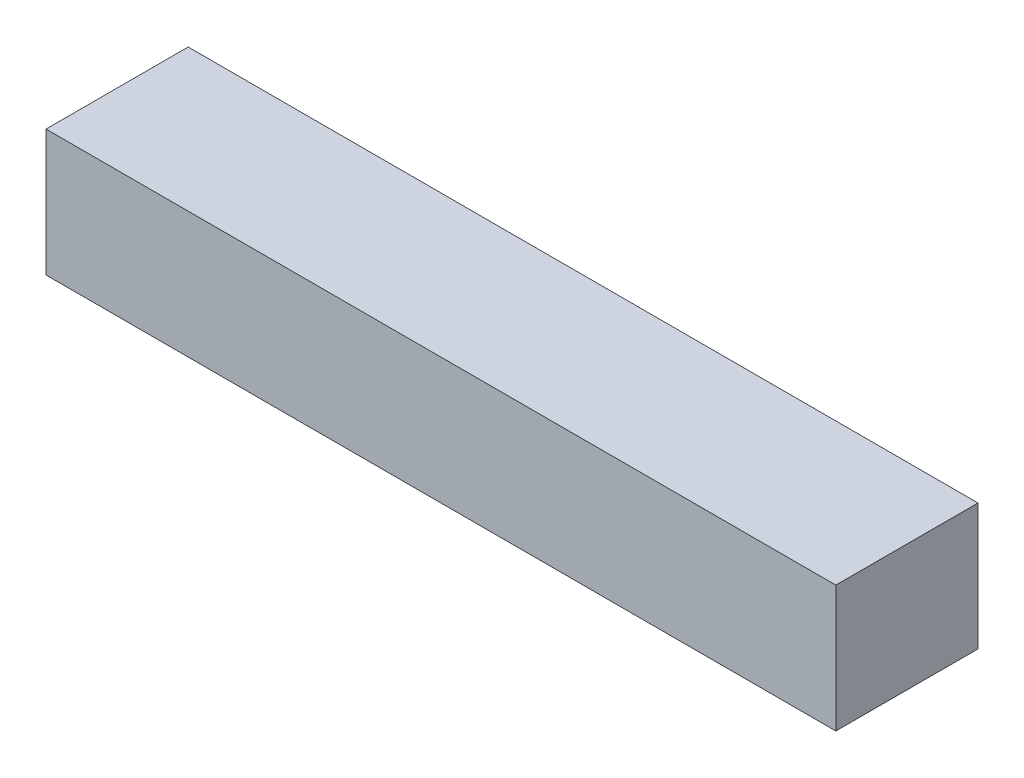
ISO-10303-21;
HEADER;
FILE_DESCRIPTION(('STEP AP214'),'2;1');
FILE_NAME('part.step','',(''),(''),'','','');
FILE_SCHEMA(('AUTOMOTIVE_DESIGN { 1 0 10303 214 1 1 1 1 }'));
ENDSEC;
DATA;
#1=APPLICATION_CONTEXT('core data for automotive mechanical design processes');
#2=APPLICATION_PROTOCOL_DEFINITION('international standard','automotive_design',2000,#1);
#3=PRODUCT_CONTEXT('',#1,'mechanical');
#4=PRODUCT('Part','Part','',(#3));
#5=PRODUCT_RELATED_PRODUCT_CATEGORY('part','',(#4));
#6=PRODUCT_DEFINITION_FORMATION('','',#4);
#7=PRODUCT_DEFINITION_CONTEXT('part definition',#1,'design');
#8=PRODUCT_DEFINITION('design','',#6,#7);
#9=PRODUCT_DEFINITION_SHAPE('','',#8);
#10=(LENGTH_UNIT() NAMED_UNIT(*) SI_UNIT(.MILLI.,.METRE.));
#11=(NAMED_UNIT(*) PLANE_ANGLE_UNIT() SI_UNIT($,.RADIAN.));
#12=(NAMED_UNIT(*) SI_UNIT($,.STERADIAN.) SOLID_ANGLE_UNIT());
#13=UNCERTAINTY_MEASURE_WITH_UNIT(LENGTH_MEASURE(1.E-05),#10,'distance_accuracy_value','');
#14=(GEOMETRIC_REPRESENTATION_CONTEXT(3) GLOBAL_UNCERTAINTY_ASSIGNED_CONTEXT((#13)) GLOBAL_UNIT_ASSIGNED_CONTEXT((#10,
#11,#12)) REPRESENTATION_CONTEXT('',''));
#15=CARTESIAN_POINT('',(0.,0.,0.));
#16=DIRECTION('',(0.,0.,1.));
#17=DIRECTION('',(1.,0.,0.));
#18=AXIS2_PLACEMENT_3D('',#15,#16,#17);
#19=CARTESIAN_POINT('',(79.,176.,39.));
#20=DIRECTION('',(0.,0.,-1.));
#21=DIRECTION('',(-1.,0.,0.));
#22=AXIS2_PLACEMENT_3D('',#19,#20,#21);
#23=PLANE('',#22);
#24=DIRECTION('',(0.,-1.,0.));
#25=VECTOR('',#24,1.);
#26=CARTESIAN_POINT('',(54.,176.,39.));
#27=LINE('',#26,#25);
#28=CARTESIAN_POINT('',(54.,180.,39.));
#29=VERTEX_POINT('',#28);
#30=CARTESIAN_POINT('',(54.,176.,39.));
#31=VERTEX_POINT('',#30);
#32=EDGE_CURVE('E133',#29,#31,#27,.T.);
#33=ORIENTED_EDGE('',*,*,#32,.T.);
#34=DIRECTION('',(-1.,0.,0.));
#35=VECTOR('',#34,1.);
#36=CARTESIAN_POINT('',(79.,176.,39.));
#37=LINE('',#36,#35);
#38=CARTESIAN_POINT('',(79.,176.,39.));
#39=VERTEX_POINT('',#38);
#40=EDGE_CURVE('E167',#39,#31,#37,.T.);
#41=ORIENTED_EDGE('',*,*,#40,.F.);
#42=DIRECTION('',(0.,-1.,0.));
#43=VECTOR('',#42,1.);
#44=CARTESIAN_POINT('',(79.,176.,39.));
#45=LINE('',#44,#43);
#46=CARTESIAN_POINT('',(79.,180.,39.));
#47=VERTEX_POINT('',#46);
#48=EDGE_CURVE('E147',#47,#39,#45,.T.);
#49=ORIENTED_EDGE('',*,*,#48,.F.);
#50=DIRECTION('',(-1.,0.,0.));
#51=VECTOR('',#50,1.);
#52=CARTESIAN_POINT('',(79.,180.,39.));
#53=LINE('',#52,#51);
#54=EDGE_CURVE('E153',#47,#29,#53,.T.);
#55=ORIENTED_EDGE('',*,*,#54,.T.);
#56=EDGE_LOOP('',(#33,#41,#49,#55));
#57=FACE_BOUND('',#56,.T.);
#58=ADVANCED_FACE('F41',(#57),#23,.F.);
#59=CARTESIAN_POINT('',(79.,176.,34.5));
#60=DIRECTION('',(0.,1.,0.));
#61=DIRECTION('',(0.,0.,1.));
#62=AXIS2_PLACEMENT_3D('',#59,#60,#61);
#63=PLANE('',#62);
#64=DIRECTION('',(-1.,0.,0.));
#65=VECTOR('',#64,1.);
#66=CARTESIAN_POINT('',(79.,176.,37.6));
#67=LINE('',#66,#65);
#68=CARTESIAN_POINT('',(69.44,176.,37.6));
#69=VERTEX_POINT('',#68);
#70=CARTESIAN_POINT('',(63.24,176.,37.6));
#71=VERTEX_POINT('',#70);
#72=EDGE_CURVE('E48',#69,#71,#67,.T.);
#73=ORIENTED_EDGE('',*,*,#72,.F.);
#74=DIRECTION('',(0.,0.,-1.));
#75=VECTOR('',#74,1.);
#76=CARTESIAN_POINT('',(69.44,176.,34.5));
#77=LINE('',#76,#75);
#78=CARTESIAN_POINT('',(69.44,176.,35.4));
#79=VERTEX_POINT('',#78);
#80=EDGE_CURVE('E11',#69,#79,#77,.T.);
#81=ORIENTED_EDGE('',*,*,#80,.T.);
#82=DIRECTION('',(1.,0.,0.));
#83=VECTOR('',#82,1.);
#84=CARTESIAN_POINT('',(79.,176.,35.4));
#85=LINE('',#84,#83);
#86=CARTESIAN_POINT('',(63.24,176.,35.4));
#87=VERTEX_POINT('',#86);
#88=EDGE_CURVE('E122',#87,#79,#85,.T.);
#89=ORIENTED_EDGE('',*,*,#88,.F.);
#90=DIRECTION('',(0.,0.,-1.));
#91=VECTOR('',#90,1.);
#92=CARTESIAN_POINT('',(63.24,176.,34.5));
#93=LINE('',#92,#91);
#94=EDGE_CURVE('E169',#71,#87,#93,.T.);
#95=ORIENTED_EDGE('',*,*,#94,.F.);
#96=EDGE_LOOP('',(#73,#81,#89,#95));
#97=FACE_BOUND('',#96,.T.);
#98=DIRECTION('',(0.,0.,-1.));
#99=VECTOR('',#98,1.);
#100=CARTESIAN_POINT('',(54.,176.,34.5));
#101=LINE('',#100,#99);
#102=CARTESIAN_POINT('',(54.,176.,34.5));
#103=VERTEX_POINT('',#102);
#104=EDGE_CURVE('E156',#31,#103,#101,.T.);
#105=ORIENTED_EDGE('',*,*,#104,.T.);
#106=DIRECTION('',(-1.,0.,0.));
#107=VECTOR('',#106,1.);
#108=CARTESIAN_POINT('',(79.,176.,34.5));
#109=LINE('',#108,#107);
#110=CARTESIAN_POINT('',(79.,176.,34.5));
#111=VERTEX_POINT('',#110);
#112=EDGE_CURVE('E164',#111,#103,#109,.T.);
#113=ORIENTED_EDGE('',*,*,#112,.F.);
#114=DIRECTION('',(0.,0.,-1.));
#115=VECTOR('',#114,1.);
#116=CARTESIAN_POINT('',(79.,176.,34.5));
#117=LINE('',#116,#115);
#118=EDGE_CURVE('E93',#39,#111,#117,.T.);
#119=ORIENTED_EDGE('',*,*,#118,.F.);
#120=ORIENTED_EDGE('',*,*,#40,.T.);
#121=EDGE_LOOP('',(#105,#113,#119,#120));
#122=FACE_BOUND('',#121,.T.);
#123=ADVANCED_FACE('F176',(#97,#122),#63,.F.);
#124=CARTESIAN_POINT('',(79.,176.,34.5));
#125=DIRECTION('',(0.,0.,1.));
#126=DIRECTION('',(1.,0.,0.));
#127=AXIS2_PLACEMENT_3D('',#124,#125,#126);
#128=PLANE('',#127);
#129=DIRECTION('',(0.,1.,0.));
#130=VECTOR('',#129,1.);
#131=CARTESIAN_POINT('',(54.,176.,34.5));
#132=LINE('',#131,#130);
#133=CARTESIAN_POINT('',(54.,180.,34.5));
#134=VERTEX_POINT('',#133);
#135=EDGE_CURVE('E158',#103,#134,#132,.T.);
#136=ORIENTED_EDGE('',*,*,#135,.T.);
#137=DIRECTION('',(-1.,0.,0.));
#138=VECTOR('',#137,1.);
#139=CARTESIAN_POINT('',(79.,180.,34.5));
#140=LINE('',#139,#138);
#141=CARTESIAN_POINT('',(79.,180.,34.5));
#142=VERTEX_POINT('',#141);
#143=EDGE_CURVE('E162',#142,#134,#140,.T.);
#144=ORIENTED_EDGE('',*,*,#143,.F.);
#145=DIRECTION('',(0.,1.,0.));
#146=VECTOR('',#145,1.);
#147=CARTESIAN_POINT('',(79.,176.,34.5));
#148=LINE('',#147,#146);
#149=EDGE_CURVE('E150',#111,#142,#148,.T.);
#150=ORIENTED_EDGE('',*,*,#149,.F.);
#151=ORIENTED_EDGE('',*,*,#112,.T.);
#152=EDGE_LOOP('',(#136,#144,#150,#151));
#153=FACE_BOUND('',#152,.T.);
#154=ADVANCED_FACE('F191',(#153),#128,.F.);
#155=CARTESIAN_POINT('',(79.,180.,34.5));
#156=DIRECTION('',(0.,-1.,0.));
#157=DIRECTION('',(0.,0.,-1.));
#158=AXIS2_PLACEMENT_3D('',#155,#156,#157);
#159=PLANE('',#158);
#160=DIRECTION('',(0.,0.,1.));
#161=VECTOR('',#160,1.);
#162=CARTESIAN_POINT('',(54.,180.,34.5));
#163=LINE('',#162,#161);
#164=EDGE_CURVE('E85',#134,#29,#163,.T.);
#165=ORIENTED_EDGE('',*,*,#164,.T.);
#166=ORIENTED_EDGE('',*,*,#54,.F.);
#167=DIRECTION('',(0.,0.,1.));
#168=VECTOR('',#167,1.);
#169=CARTESIAN_POINT('',(79.,180.,34.5));
#170=LINE('',#169,#168);
#171=EDGE_CURVE('E64',#142,#47,#170,.T.);
#172=ORIENTED_EDGE('',*,*,#171,.F.);
#173=ORIENTED_EDGE('',*,*,#143,.T.);
#174=EDGE_LOOP('',(#165,#166,#172,#173));
#175=FACE_BOUND('',#174,.T.);
#176=ADVANCED_FACE('F203',(#175),#159,.F.);
#177=CARTESIAN_POINT('',(79.,0.,0.));
#178=DIRECTION('',(1.,0.,0.));
#179=DIRECTION('',(0.,0.,-1.));
#180=AXIS2_PLACEMENT_3D('',#177,#178,#179);
#181=PLANE('',#180);
#182=ORIENTED_EDGE('',*,*,#48,.T.);
#183=ORIENTED_EDGE('',*,*,#118,.T.);
#184=ORIENTED_EDGE('',*,*,#149,.T.);
#185=ORIENTED_EDGE('',*,*,#171,.T.);
#186=EDGE_LOOP('',(#182,#183,#184,#185));
#187=FACE_BOUND('',#186,.T.);
#188=ADVANCED_FACE('F201',(#187),#181,.T.);
#189=CARTESIAN_POINT('',(54.,0.,0.));
#190=DIRECTION('',(1.,0.,0.));
#191=DIRECTION('',(0.,0.,-1.));
#192=AXIS2_PLACEMENT_3D('',#189,#190,#191);
#193=PLANE('',#192);
#194=ORIENTED_EDGE('',*,*,#32,.F.);
#195=ORIENTED_EDGE('',*,*,#164,.F.);
#196=ORIENTED_EDGE('',*,*,#135,.F.);
#197=ORIENTED_EDGE('',*,*,#104,.F.);
#198=EDGE_LOOP('',(#194,#195,#196,#197));
#199=FACE_BOUND('',#198,.T.);
#200=ADVANCED_FACE('F196',(#199),#193,.F.);
#201=CARTESIAN_POINT('',(69.44,175.9,37.6));
#202=DIRECTION('',(0.,0.,-1.));
#203=DIRECTION('',(-1.,0.,0.));
#204=AXIS2_PLACEMENT_3D('',#201,#202,#203);
#205=PLANE('',#204);
#206=ORIENTED_EDGE('',*,*,#72,.T.);
#207=DIRECTION('',(0.,-1.,0.));
#208=VECTOR('',#207,1.);
#209=CARTESIAN_POINT('',(63.24,175.9,37.6));
#210=LINE('',#209,#208);
#211=CARTESIAN_POINT('',(63.24,177.5,37.6));
#212=VERTEX_POINT('',#211);
#213=EDGE_CURVE('E55',#212,#71,#210,.T.);
#214=ORIENTED_EDGE('',*,*,#213,.F.);
#215=DIRECTION('',(-1.,0.,0.));
#216=VECTOR('',#215,1.);
#217=CARTESIAN_POINT('',(69.44,177.5,37.6));
#218=LINE('',#217,#216);
#219=CARTESIAN_POINT('',(69.44,177.5,37.6));
#220=VERTEX_POINT('',#219);
#221=EDGE_CURVE('E134',#220,#212,#218,.T.);
#222=ORIENTED_EDGE('',*,*,#221,.F.);
#223=DIRECTION('',(0.,-1.,0.));
#224=VECTOR('',#223,1.);
#225=CARTESIAN_POINT('',(69.44,175.9,37.6));
#226=LINE('',#225,#224);
#227=EDGE_CURVE('E126',#220,#69,#226,.T.);
#228=ORIENTED_EDGE('',*,*,#227,.T.);
#229=EDGE_LOOP('',(#206,#214,#222,#228));
#230=FACE_BOUND('',#229,.T.);
#231=ADVANCED_FACE('F174',(#230),#205,.T.);
#232=CARTESIAN_POINT('',(69.44,175.9,35.4));
#233=DIRECTION('',(0.,0.,1.));
#234=DIRECTION('',(1.,0.,0.));
#235=AXIS2_PLACEMENT_3D('',#232,#233,#234);
#236=PLANE('',#235);
#237=ORIENTED_EDGE('',*,*,#88,.T.);
#238=DIRECTION('',(0.,1.,0.));
#239=VECTOR('',#238,1.);
#240=CARTESIAN_POINT('',(69.44,175.9,35.4));
#241=LINE('',#240,#239);
#242=CARTESIAN_POINT('',(69.44,177.5,35.4));
#243=VERTEX_POINT('',#242);
#244=EDGE_CURVE('E115',#79,#243,#241,.T.);
#245=ORIENTED_EDGE('',*,*,#244,.T.);
#246=DIRECTION('',(-1.,0.,0.));
#247=VECTOR('',#246,1.);
#248=CARTESIAN_POINT('',(69.44,177.5,35.4));
#249=LINE('',#248,#247);
#250=CARTESIAN_POINT('',(63.24,177.5,35.4));
#251=VERTEX_POINT('',#250);
#252=EDGE_CURVE('E119',#243,#251,#249,.T.);
#253=ORIENTED_EDGE('',*,*,#252,.T.);
#254=DIRECTION('',(0.,1.,0.));
#255=VECTOR('',#254,1.);
#256=CARTESIAN_POINT('',(63.24,175.9,35.4));
#257=LINE('',#256,#255);
#258=EDGE_CURVE('E144',#87,#251,#257,.T.);
#259=ORIENTED_EDGE('',*,*,#258,.F.);
#260=EDGE_LOOP('',(#237,#245,#253,#259));
#261=FACE_BOUND('',#260,.T.);
#262=ADVANCED_FACE('F117',(#261),#236,.T.);
#263=CARTESIAN_POINT('',(69.44,0.,0.));
#264=DIRECTION('',(1.,0.,0.));
#265=DIRECTION('',(0.,0.,-1.));
#266=AXIS2_PLACEMENT_3D('',#263,#264,#265);
#267=PLANE('',#266);
#268=ORIENTED_EDGE('',*,*,#227,.F.);
#269=DIRECTION('',(0.,0.,1.));
#270=VECTOR('',#269,1.);
#271=CARTESIAN_POINT('',(69.44,177.5,35.4));
#272=LINE('',#271,#270);
#273=EDGE_CURVE('E125',#243,#220,#272,.T.);
#274=ORIENTED_EDGE('',*,*,#273,.F.);
#275=ORIENTED_EDGE('',*,*,#244,.F.);
#276=ORIENTED_EDGE('',*,*,#80,.F.);
#277=EDGE_LOOP('',(#268,#274,#275,#276));
#278=FACE_BOUND('',#277,.T.);
#279=ADVANCED_FACE('F137',(#278),#267,.F.);
#280=CARTESIAN_POINT('',(63.24,0.,0.));
#281=DIRECTION('',(1.,0.,0.));
#282=DIRECTION('',(0.,0.,-1.));
#283=AXIS2_PLACEMENT_3D('',#280,#281,#282);
#284=PLANE('',#283);
#285=ORIENTED_EDGE('',*,*,#94,.T.);
#286=ORIENTED_EDGE('',*,*,#258,.T.);
#287=DIRECTION('',(0.,0.,1.));
#288=VECTOR('',#287,1.);
#289=CARTESIAN_POINT('',(63.24,177.5,35.4));
#290=LINE('',#289,#288);
#291=EDGE_CURVE('E132',#251,#212,#290,.T.);
#292=ORIENTED_EDGE('',*,*,#291,.T.);
#293=ORIENTED_EDGE('',*,*,#213,.T.);
#294=EDGE_LOOP('',(#285,#286,#292,#293));
#295=FACE_BOUND('',#294,.T.);
#296=ADVANCED_FACE('F177',(#295),#284,.T.);
#297=CARTESIAN_POINT('',(69.44,177.5,35.4));
#298=DIRECTION('',(0.,-1.,0.));
#299=DIRECTION('',(0.,0.,-1.));
#300=AXIS2_PLACEMENT_3D('',#297,#298,#299);
#301=PLANE('',#300);
#302=ORIENTED_EDGE('',*,*,#291,.F.);
#303=ORIENTED_EDGE('',*,*,#252,.F.);
#304=ORIENTED_EDGE('',*,*,#273,.T.);
#305=ORIENTED_EDGE('',*,*,#221,.T.);
#306=EDGE_LOOP('',(#302,#303,#304,#305));
#307=FACE_BOUND('',#306,.T.);
#308=ADVANCED_FACE('F129',(#307),#301,.T.);
#309=CLOSED_SHELL('',(#58,#123,#154,#176,#188,#200,#231,#262,#279,#296,#308));
#310=MANIFOLD_SOLID_BREP('B2',#309);
#311=ADVANCED_BREP_SHAPE_REPRESENTATION('',(#18,#310),#14);
#312=SHAPE_DEFINITION_REPRESENTATION(#9,#311);
ENDSEC;
END-ISO-10303-21;
